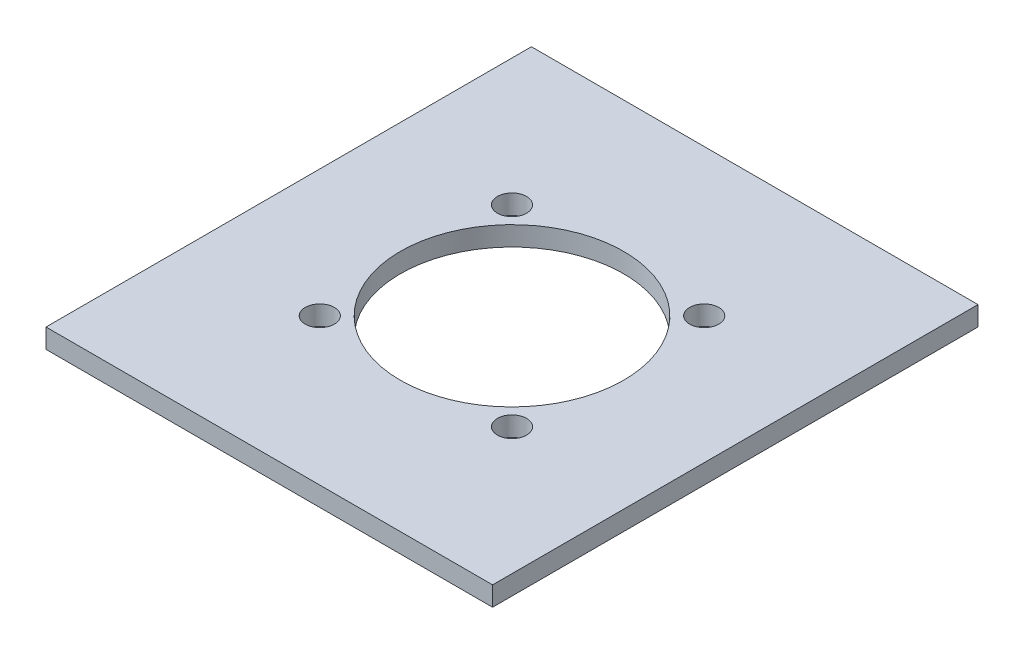
ISO-10303-21;
HEADER;
FILE_DESCRIPTION(('STEP AP214'),'2;1');
FILE_NAME('part.step','',(''),(''),'','','');
FILE_SCHEMA(('AUTOMOTIVE_DESIGN { 1 0 10303 214 1 1 1 1 }'));
ENDSEC;
DATA;
#1=APPLICATION_CONTEXT('core data for automotive mechanical design processes');
#2=APPLICATION_PROTOCOL_DEFINITION('international standard','automotive_design',2000,#1);
#3=PRODUCT_CONTEXT('',#1,'mechanical');
#4=PRODUCT('Part','Part','',(#3));
#5=PRODUCT_RELATED_PRODUCT_CATEGORY('part','',(#4));
#6=PRODUCT_DEFINITION_FORMATION('','',#4);
#7=PRODUCT_DEFINITION_CONTEXT('part definition',#1,'design');
#8=PRODUCT_DEFINITION('design','',#6,#7);
#9=PRODUCT_DEFINITION_SHAPE('','',#8);
#10=(LENGTH_UNIT() NAMED_UNIT(*) SI_UNIT(.MILLI.,.METRE.));
#11=(NAMED_UNIT(*) PLANE_ANGLE_UNIT() SI_UNIT($,.RADIAN.));
#12=(NAMED_UNIT(*) SI_UNIT($,.STERADIAN.) SOLID_ANGLE_UNIT());
#13=UNCERTAINTY_MEASURE_WITH_UNIT(LENGTH_MEASURE(1.E-05),#10,'distance_accuracy_value','');
#14=(GEOMETRIC_REPRESENTATION_CONTEXT(3) GLOBAL_UNCERTAINTY_ASSIGNED_CONTEXT((#13)) GLOBAL_UNIT_ASSIGNED_CONTEXT((#10,
#11,#12)) REPRESENTATION_CONTEXT('',''));
#15=CARTESIAN_POINT('',(0.,0.,0.));
#16=DIRECTION('',(0.,0.,1.));
#17=DIRECTION('',(1.,0.,0.));
#18=AXIS2_PLACEMENT_3D('',#15,#16,#17);
#19=CARTESIAN_POINT('',(23.,2.,25.));
#20=DIRECTION('',(-1.,0.,0.));
#21=DIRECTION('',(0.,0.,1.));
#22=AXIS2_PLACEMENT_3D('',#19,#20,#21);
#23=PLANE('',#22);
#24=DIRECTION('',(0.,0.,-1.));
#25=VECTOR('',#24,1.);
#26=CARTESIAN_POINT('',(23.,0.,25.));
#27=LINE('',#26,#25);
#28=CARTESIAN_POINT('',(23.,0.,25.));
#29=VERTEX_POINT('',#28);
#30=CARTESIAN_POINT('',(23.,0.,-25.));
#31=VERTEX_POINT('',#30);
#32=EDGE_CURVE('E100',#29,#31,#27,.T.);
#33=ORIENTED_EDGE('',*,*,#32,.T.);
#34=DIRECTION('',(0.,-1.,0.));
#35=VECTOR('',#34,1.);
#36=CARTESIAN_POINT('',(23.,2.,-25.));
#37=LINE('',#36,#35);
#38=CARTESIAN_POINT('',(23.,2.,-25.));
#39=VERTEX_POINT('',#38);
#40=EDGE_CURVE('E11',#39,#31,#37,.T.);
#41=ORIENTED_EDGE('',*,*,#40,.F.);
#42=DIRECTION('',(0.,0.,-1.));
#43=VECTOR('',#42,1.);
#44=CARTESIAN_POINT('',(23.,2.,25.));
#45=LINE('',#44,#43);
#46=CARTESIAN_POINT('',(23.,2.,25.));
#47=VERTEX_POINT('',#46);
#48=EDGE_CURVE('E88',#47,#39,#45,.T.);
#49=ORIENTED_EDGE('',*,*,#48,.F.);
#50=DIRECTION('',(0.,-1.,0.));
#51=VECTOR('',#50,1.);
#52=CARTESIAN_POINT('',(23.,2.,25.));
#53=LINE('',#52,#51);
#54=EDGE_CURVE('E96',#47,#29,#53,.T.);
#55=ORIENTED_EDGE('',*,*,#54,.T.);
#56=EDGE_LOOP('',(#33,#41,#49,#55));
#57=FACE_BOUND('',#56,.T.);
#58=ADVANCED_FACE('F37',(#57),#23,.F.);
#59=CARTESIAN_POINT('',(-23.,2.,-25.));
#60=DIRECTION('',(0.,0.,1.));
#61=DIRECTION('',(1.,0.,0.));
#62=AXIS2_PLACEMENT_3D('',#59,#60,#61);
#63=PLANE('',#62);
#64=DIRECTION('',(-1.,0.,0.));
#65=VECTOR('',#64,1.);
#66=CARTESIAN_POINT('',(-23.,0.,-25.));
#67=LINE('',#66,#65);
#68=CARTESIAN_POINT('',(-23.,0.,-25.));
#69=VERTEX_POINT('',#68);
#70=EDGE_CURVE('E92',#31,#69,#67,.T.);
#71=ORIENTED_EDGE('',*,*,#70,.T.);
#72=DIRECTION('',(0.,-1.,0.));
#73=VECTOR('',#72,1.);
#74=CARTESIAN_POINT('',(-23.,2.,-25.));
#75=LINE('',#74,#73);
#76=CARTESIAN_POINT('',(-23.,2.,-25.));
#77=VERTEX_POINT('',#76);
#78=EDGE_CURVE('E45',#77,#69,#75,.T.);
#79=ORIENTED_EDGE('',*,*,#78,.F.);
#80=DIRECTION('',(-1.,0.,0.));
#81=VECTOR('',#80,1.);
#82=CARTESIAN_POINT('',(-23.,2.,-25.));
#83=LINE('',#82,#81);
#84=EDGE_CURVE('E83',#39,#77,#83,.T.);
#85=ORIENTED_EDGE('',*,*,#84,.F.);
#86=ORIENTED_EDGE('',*,*,#40,.T.);
#87=EDGE_LOOP('',(#71,#79,#85,#86));
#88=FACE_BOUND('',#87,.T.);
#89=ADVANCED_FACE('F91',(#88),#63,.F.);
#90=CARTESIAN_POINT('',(-23.,2.,25.));
#91=DIRECTION('',(1.,0.,0.));
#92=DIRECTION('',(0.,0.,-1.));
#93=AXIS2_PLACEMENT_3D('',#90,#91,#92);
#94=PLANE('',#93);
#95=DIRECTION('',(0.,0.,1.));
#96=VECTOR('',#95,1.);
#97=CARTESIAN_POINT('',(-23.,0.,25.));
#98=LINE('',#97,#96);
#99=CARTESIAN_POINT('',(-23.,0.,25.));
#100=VERTEX_POINT('',#99);
#101=EDGE_CURVE('E70',#69,#100,#98,.T.);
#102=ORIENTED_EDGE('',*,*,#101,.T.);
#103=DIRECTION('',(0.,-1.,0.));
#104=VECTOR('',#103,1.);
#105=CARTESIAN_POINT('',(-23.,2.,25.));
#106=LINE('',#105,#104);
#107=CARTESIAN_POINT('',(-23.,2.,25.));
#108=VERTEX_POINT('',#107);
#109=EDGE_CURVE('E93',#108,#100,#106,.T.);
#110=ORIENTED_EDGE('',*,*,#109,.F.);
#111=DIRECTION('',(0.,0.,1.));
#112=VECTOR('',#111,1.);
#113=CARTESIAN_POINT('',(-23.,2.,25.));
#114=LINE('',#113,#112);
#115=EDGE_CURVE('E86',#77,#108,#114,.T.);
#116=ORIENTED_EDGE('',*,*,#115,.F.);
#117=ORIENTED_EDGE('',*,*,#78,.T.);
#118=EDGE_LOOP('',(#102,#110,#116,#117));
#119=FACE_BOUND('',#118,.T.);
#120=ADVANCED_FACE('F94',(#119),#94,.F.);
#121=CARTESIAN_POINT('',(-23.,2.,25.));
#122=DIRECTION('',(0.,0.,-1.));
#123=DIRECTION('',(-1.,0.,0.));
#124=AXIS2_PLACEMENT_3D('',#121,#122,#123);
#125=PLANE('',#124);
#126=DIRECTION('',(1.,0.,0.));
#127=VECTOR('',#126,1.);
#128=CARTESIAN_POINT('',(-23.,0.,25.));
#129=LINE('',#128,#127);
#130=EDGE_CURVE('E76',#100,#29,#129,.T.);
#131=ORIENTED_EDGE('',*,*,#130,.T.);
#132=ORIENTED_EDGE('',*,*,#54,.F.);
#133=DIRECTION('',(1.,0.,0.));
#134=VECTOR('',#133,1.);
#135=CARTESIAN_POINT('',(-23.,2.,25.));
#136=LINE('',#135,#134);
#137=EDGE_CURVE('E53',#108,#47,#136,.T.);
#138=ORIENTED_EDGE('',*,*,#137,.F.);
#139=ORIENTED_EDGE('',*,*,#109,.T.);
#140=EDGE_LOOP('',(#131,#132,#138,#139));
#141=FACE_BOUND('',#140,.T.);
#142=ADVANCED_FACE('F108',(#141),#125,.F.);
#143=CARTESIAN_POINT('',(0.,2.,0.));
#144=DIRECTION('',(0.,-1.,0.));
#145=DIRECTION('',(0.,0.,-1.));
#146=AXIS2_PLACEMENT_3D('',#143,#144,#145);
#147=PLANE('',#146);
#148=CARTESIAN_POINT('',(9.89949493661169,2.,9.89949493661164));
#149=DIRECTION('',(0.,1.,0.));
#150=DIRECTION('',(0.,0.,1.));
#151=AXIS2_PLACEMENT_3D('',#148,#149,#150);
#152=CIRCLE('',#151,1.5);
#153=CARTESIAN_POINT('',(9.89949493661169,2.,11.3994949366116));
#154=VERTEX_POINT('',#153);
#155=EDGE_CURVE('E126',#154,#154,#152,.T.);
#156=ORIENTED_EDGE('',*,*,#155,.F.);
#157=EDGE_LOOP('',(#156));
#158=FACE_BOUND('',#157,.T.);
#159=CARTESIAN_POINT('',(-9.89949493661161,2.,9.89949493661173));
#160=DIRECTION('',(0.,1.,0.));
#161=DIRECTION('',(0.,0.,1.));
#162=AXIS2_PLACEMENT_3D('',#159,#160,#161);
#163=CIRCLE('',#162,1.5);
#164=CARTESIAN_POINT('',(-9.89949493661161,2.,11.3994949366117));
#165=VERTEX_POINT('',#164);
#166=EDGE_CURVE('E132',#165,#165,#163,.T.);
#167=ORIENTED_EDGE('',*,*,#166,.F.);
#168=EDGE_LOOP('',(#167));
#169=FACE_BOUND('',#168,.T.);
#170=CARTESIAN_POINT('',(-9.89949493661168,2.,-9.89949493661165));
#171=DIRECTION('',(0.,1.,0.));
#172=DIRECTION('',(0.,0.,1.));
#173=AXIS2_PLACEMENT_3D('',#170,#171,#172);
#174=CIRCLE('',#173,1.5);
#175=CARTESIAN_POINT('',(-9.89949493661168,2.,-8.39949493661165));
#176=VERTEX_POINT('',#175);
#177=EDGE_CURVE('E138',#176,#176,#174,.T.);
#178=ORIENTED_EDGE('',*,*,#177,.F.);
#179=EDGE_LOOP('',(#178));
#180=FACE_BOUND('',#179,.T.);
#181=CARTESIAN_POINT('',(9.89949493661161,2.,-9.89949493661173));
#182=DIRECTION('',(0.,1.,0.));
#183=DIRECTION('',(0.,0.,1.));
#184=AXIS2_PLACEMENT_3D('',#181,#182,#183);
#185=CIRCLE('',#184,1.5);
#186=CARTESIAN_POINT('',(9.89949493661161,2.,-8.39949493661173));
#187=VERTEX_POINT('',#186);
#188=EDGE_CURVE('E120',#187,#187,#185,.T.);
#189=ORIENTED_EDGE('',*,*,#188,.F.);
#190=EDGE_LOOP('',(#189));
#191=FACE_BOUND('',#190,.T.);
#192=CARTESIAN_POINT('',(0.,2.,0.));
#193=DIRECTION('',(0.,1.,0.));
#194=DIRECTION('',(0.,0.,1.));
#195=AXIS2_PLACEMENT_3D('',#192,#193,#194);
#196=CIRCLE('',#195,11.5);
#197=CARTESIAN_POINT('',(0.,2.,11.5));
#198=VERTEX_POINT('',#197);
#199=EDGE_CURVE('E114',#198,#198,#196,.T.);
#200=ORIENTED_EDGE('',*,*,#199,.F.);
#201=EDGE_LOOP('',(#200));
#202=FACE_BOUND('',#201,.T.);
#203=ORIENTED_EDGE('',*,*,#48,.T.);
#204=ORIENTED_EDGE('',*,*,#84,.T.);
#205=ORIENTED_EDGE('',*,*,#115,.T.);
#206=ORIENTED_EDGE('',*,*,#137,.T.);
#207=EDGE_LOOP('',(#203,#204,#205,#206));
#208=FACE_BOUND('',#207,.T.);
#209=ADVANCED_FACE('F84',(#158,#169,#180,#191,#202,#208),#147,.F.);
#210=CARTESIAN_POINT('',(0.,0.,0.));
#211=DIRECTION('',(0.,-1.,0.));
#212=DIRECTION('',(0.,0.,-1.));
#213=AXIS2_PLACEMENT_3D('',#210,#211,#212);
#214=PLANE('',#213);
#215=CARTESIAN_POINT('',(9.89949493661169,0.,9.89949493661164));
#216=DIRECTION('',(0.,1.,0.));
#217=DIRECTION('',(0.,0.,1.));
#218=AXIS2_PLACEMENT_3D('',#215,#216,#217);
#219=CIRCLE('',#218,1.5);
#220=CARTESIAN_POINT('',(9.89949493661169,0.,11.3994949366116));
#221=VERTEX_POINT('',#220);
#222=EDGE_CURVE('E129',#221,#221,#219,.T.);
#223=ORIENTED_EDGE('',*,*,#222,.T.);
#224=EDGE_LOOP('',(#223));
#225=FACE_BOUND('',#224,.T.);
#226=CARTESIAN_POINT('',(-9.89949493661161,0.,9.89949493661173));
#227=DIRECTION('',(0.,1.,0.));
#228=DIRECTION('',(0.,0.,1.));
#229=AXIS2_PLACEMENT_3D('',#226,#227,#228);
#230=CIRCLE('',#229,1.5);
#231=CARTESIAN_POINT('',(-9.89949493661161,0.,11.3994949366117));
#232=VERTEX_POINT('',#231);
#233=EDGE_CURVE('E135',#232,#232,#230,.T.);
#234=ORIENTED_EDGE('',*,*,#233,.T.);
#235=EDGE_LOOP('',(#234));
#236=FACE_BOUND('',#235,.T.);
#237=CARTESIAN_POINT('',(-9.89949493661168,0.,-9.89949493661165));
#238=DIRECTION('',(0.,1.,0.));
#239=DIRECTION('',(0.,0.,1.));
#240=AXIS2_PLACEMENT_3D('',#237,#238,#239);
#241=CIRCLE('',#240,1.5);
#242=CARTESIAN_POINT('',(-9.89949493661168,0.,-8.39949493661165));
#243=VERTEX_POINT('',#242);
#244=EDGE_CURVE('E123',#243,#243,#241,.T.);
#245=ORIENTED_EDGE('',*,*,#244,.T.);
#246=EDGE_LOOP('',(#245));
#247=FACE_BOUND('',#246,.T.);
#248=CARTESIAN_POINT('',(9.89949493661161,0.,-9.89949493661173));
#249=DIRECTION('',(0.,1.,0.));
#250=DIRECTION('',(0.,0.,1.));
#251=AXIS2_PLACEMENT_3D('',#248,#249,#250);
#252=CIRCLE('',#251,1.5);
#253=CARTESIAN_POINT('',(9.89949493661161,0.,-8.39949493661173));
#254=VERTEX_POINT('',#253);
#255=EDGE_CURVE('E117',#254,#254,#252,.T.);
#256=ORIENTED_EDGE('',*,*,#255,.T.);
#257=EDGE_LOOP('',(#256));
#258=FACE_BOUND('',#257,.T.);
#259=CARTESIAN_POINT('',(0.,0.,0.));
#260=DIRECTION('',(0.,1.,0.));
#261=DIRECTION('',(0.,0.,1.));
#262=AXIS2_PLACEMENT_3D('',#259,#260,#261);
#263=CIRCLE('',#262,11.5);
#264=CARTESIAN_POINT('',(0.,0.,11.5));
#265=VERTEX_POINT('',#264);
#266=EDGE_CURVE('E103',#265,#265,#263,.T.);
#267=ORIENTED_EDGE('',*,*,#266,.T.);
#268=EDGE_LOOP('',(#267));
#269=FACE_BOUND('',#268,.T.);
#270=ORIENTED_EDGE('',*,*,#32,.F.);
#271=ORIENTED_EDGE('',*,*,#130,.F.);
#272=ORIENTED_EDGE('',*,*,#101,.F.);
#273=ORIENTED_EDGE('',*,*,#70,.F.);
#274=EDGE_LOOP('',(#270,#271,#272,#273));
#275=FACE_BOUND('',#274,.T.);
#276=ADVANCED_FACE('F111',(#225,#236,#247,#258,#269,#275),#214,.T.);
#277=CARTESIAN_POINT('',(0.,0.,0.));
#278=DIRECTION('',(0.,1.,0.));
#279=DIRECTION('',(0.,0.,1.));
#280=AXIS2_PLACEMENT_3D('',#277,#278,#279);
#281=CYLINDRICAL_SURFACE('',#280,11.5);
#282=ORIENTED_EDGE('',*,*,#266,.F.);
#283=EDGE_LOOP('',(#282));
#284=FACE_BOUND('',#283,.T.);
#285=ORIENTED_EDGE('',*,*,#199,.T.);
#286=EDGE_LOOP('',(#285));
#287=FACE_BOUND('',#286,.T.);
#288=ADVANCED_FACE('F162',(#284,#287),#281,.F.);
#289=CARTESIAN_POINT('',(9.89949493661161,0.,-9.89949493661173));
#290=DIRECTION('',(0.,1.,0.));
#291=DIRECTION('',(0.,0.,1.));
#292=AXIS2_PLACEMENT_3D('',#289,#290,#291);
#293=CYLINDRICAL_SURFACE('',#292,1.5);
#294=ORIENTED_EDGE('',*,*,#255,.F.);
#295=EDGE_LOOP('',(#294));
#296=FACE_BOUND('',#295,.T.);
#297=ORIENTED_EDGE('',*,*,#188,.T.);
#298=EDGE_LOOP('',(#297));
#299=FACE_BOUND('',#298,.T.);
#300=ADVANCED_FACE('F150',(#296,#299),#293,.F.);
#301=CARTESIAN_POINT('',(-9.89949493661168,0.,-9.89949493661165));
#302=DIRECTION('',(0.,1.,0.));
#303=DIRECTION('',(0.,0.,1.));
#304=AXIS2_PLACEMENT_3D('',#301,#302,#303);
#305=CYLINDRICAL_SURFACE('',#304,1.5);
#306=ORIENTED_EDGE('',*,*,#244,.F.);
#307=EDGE_LOOP('',(#306));
#308=FACE_BOUND('',#307,.T.);
#309=ORIENTED_EDGE('',*,*,#177,.T.);
#310=EDGE_LOOP('',(#309));
#311=FACE_BOUND('',#310,.T.);
#312=ADVANCED_FACE('F146',(#308,#311),#305,.F.);
#313=CARTESIAN_POINT('',(-9.89949493661161,0.,9.89949493661173));
#314=DIRECTION('',(0.,1.,0.));
#315=DIRECTION('',(0.,0.,1.));
#316=AXIS2_PLACEMENT_3D('',#313,#314,#315);
#317=CYLINDRICAL_SURFACE('',#316,1.5);
#318=ORIENTED_EDGE('',*,*,#233,.F.);
#319=EDGE_LOOP('',(#318));
#320=FACE_BOUND('',#319,.T.);
#321=ORIENTED_EDGE('',*,*,#166,.T.);
#322=EDGE_LOOP('',(#321));
#323=FACE_BOUND('',#322,.T.);
#324=ADVANCED_FACE('F149',(#320,#323),#317,.F.);
#325=CARTESIAN_POINT('',(9.89949493661169,0.,9.89949493661164));
#326=DIRECTION('',(0.,1.,0.));
#327=DIRECTION('',(0.,0.,1.));
#328=AXIS2_PLACEMENT_3D('',#325,#326,#327);
#329=CYLINDRICAL_SURFACE('',#328,1.5);
#330=ORIENTED_EDGE('',*,*,#222,.F.);
#331=EDGE_LOOP('',(#330));
#332=FACE_BOUND('',#331,.T.);
#333=ORIENTED_EDGE('',*,*,#155,.T.);
#334=EDGE_LOOP('',(#333));
#335=FACE_BOUND('',#334,.T.);
#336=ADVANCED_FACE('F219',(#332,#335),#329,.F.);
#337=CLOSED_SHELL('',(#58,#89,#120,#142,#209,#276,#288,#300,#312,#324,#336));
#338=MANIFOLD_SOLID_BREP('B2',#337);
#339=ADVANCED_BREP_SHAPE_REPRESENTATION('',(#18,#338),#14);
#340=SHAPE_DEFINITION_REPRESENTATION(#9,#339);
ENDSEC;
END-ISO-10303-21;
